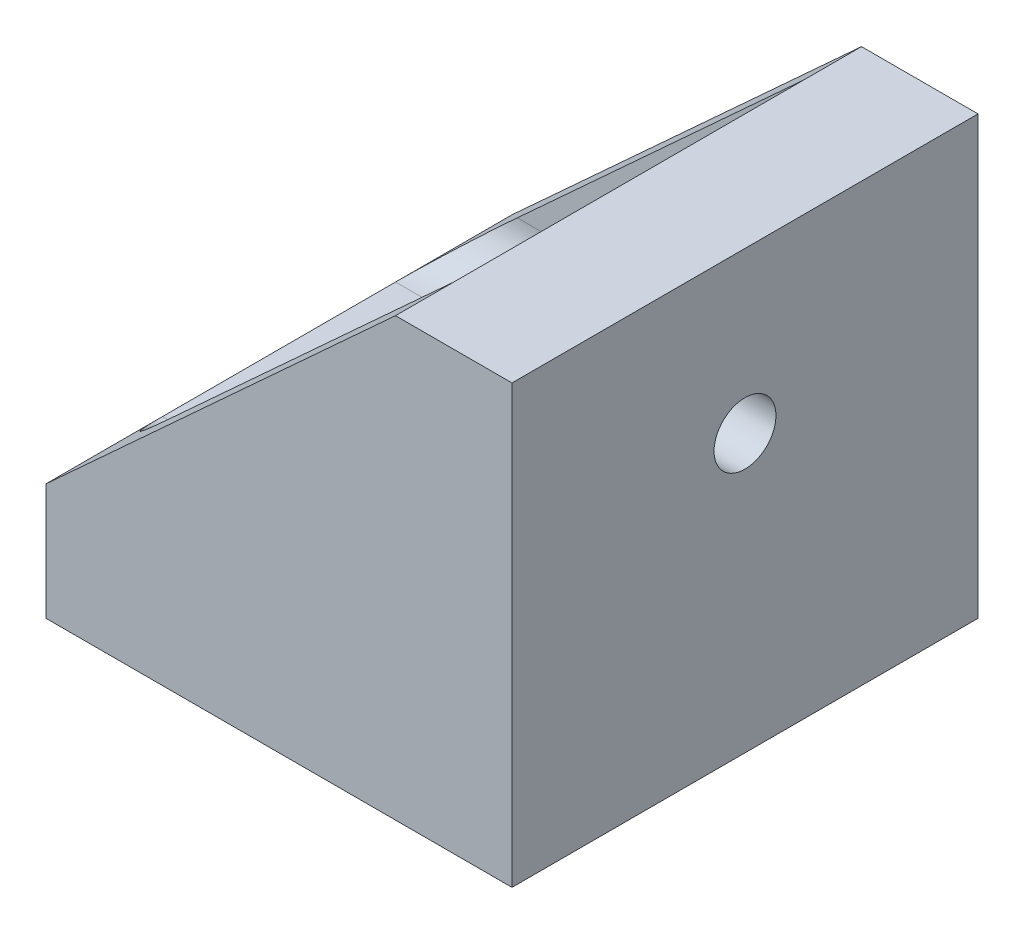
ISO-10303-21;
HEADER;
FILE_DESCRIPTION(('STEP AP214'),'2;1');
FILE_NAME('part.step','',(''),(''),'','','');
FILE_SCHEMA(('AUTOMOTIVE_DESIGN { 1 0 10303 214 1 1 1 1 }'));
ENDSEC;
DATA;
#1=APPLICATION_CONTEXT('core data for automotive mechanical design processes');
#2=APPLICATION_PROTOCOL_DEFINITION('international standard','automotive_design',2000,#1);
#3=PRODUCT_CONTEXT('',#1,'mechanical');
#4=PRODUCT('Part','Part','',(#3));
#5=PRODUCT_RELATED_PRODUCT_CATEGORY('part','',(#4));
#6=PRODUCT_DEFINITION_FORMATION('','',#4);
#7=PRODUCT_DEFINITION_CONTEXT('part definition',#1,'design');
#8=PRODUCT_DEFINITION('design','',#6,#7);
#9=PRODUCT_DEFINITION_SHAPE('','',#8);
#10=(LENGTH_UNIT() NAMED_UNIT(*) SI_UNIT(.MILLI.,.METRE.));
#11=(NAMED_UNIT(*) PLANE_ANGLE_UNIT() SI_UNIT($,.RADIAN.));
#12=(NAMED_UNIT(*) SI_UNIT($,.STERADIAN.) SOLID_ANGLE_UNIT());
#13=UNCERTAINTY_MEASURE_WITH_UNIT(LENGTH_MEASURE(1.E-05),#10,'distance_accuracy_value','');
#14=(GEOMETRIC_REPRESENTATION_CONTEXT(3) GLOBAL_UNCERTAINTY_ASSIGNED_CONTEXT((#13)) GLOBAL_UNIT_ASSIGNED_CONTEXT((#10,
#11,#12)) REPRESENTATION_CONTEXT('',''));
#15=CARTESIAN_POINT('',(0.,0.,0.));
#16=DIRECTION('',(0.,0.,1.));
#17=DIRECTION('',(1.,0.,0.));
#18=AXIS2_PLACEMENT_3D('',#15,#16,#17);
#19=CARTESIAN_POINT('',(76.2,25.4,50.8));
#20=DIRECTION('',(1.,0.,0.));
#21=DIRECTION('',(0.,0.,-1.));
#22=AXIS2_PLACEMENT_3D('',#19,#20,#21);
#23=PLANE('',#22);
#24=CARTESIAN_POINT('',(76.2,60.325,0.));
#25=DIRECTION('',(-1.,0.,0.));
#26=DIRECTION('',(0.,0.,1.));
#27=AXIS2_PLACEMENT_3D('',#24,#25,#26);
#28=CIRCLE('',#27,11.89);
#29=CARTESIAN_POINT('',(76.2,60.325,11.89));
#30=VERTEX_POINT('',#29);
#31=EDGE_CURVE('E150',#30,#30,#28,.T.);
#32=ORIENTED_EDGE('',*,*,#31,.F.);
#33=EDGE_LOOP('',(#32));
#34=FACE_BOUND('',#33,.T.);
#35=DIRECTION('',(0.,-1.,0.));
#36=VECTOR('',#35,1.);
#37=CARTESIAN_POINT('',(76.2,25.4,-38.1));
#38=LINE('',#37,#36);
#39=CARTESIAN_POINT('',(76.2,95.25,-38.1));
#40=VERTEX_POINT('',#39);
#41=CARTESIAN_POINT('',(76.2,38.1,-38.1));
#42=VERTEX_POINT('',#41);
#43=EDGE_CURVE('E114',#40,#42,#38,.T.);
#44=ORIENTED_EDGE('',*,*,#43,.T.);
#45=DIRECTION('',(0.,0.,-1.));
#46=VECTOR('',#45,1.);
#47=CARTESIAN_POINT('',(76.2,38.1,38.1));
#48=LINE('',#47,#46);
#49=CARTESIAN_POINT('',(76.2,38.1,38.1));
#50=VERTEX_POINT('',#49);
#51=EDGE_CURVE('E107',#42,#50,#48,.F.);
#52=ORIENTED_EDGE('',*,*,#51,.T.);
#53=DIRECTION('',(0.,-1.,0.));
#54=VECTOR('',#53,1.);
#55=CARTESIAN_POINT('',(76.2,25.4,38.1));
#56=LINE('',#55,#54);
#57=CARTESIAN_POINT('',(76.2,95.25,38.1));
#58=VERTEX_POINT('',#57);
#59=EDGE_CURVE('E134',#58,#50,#56,.T.);
#60=ORIENTED_EDGE('',*,*,#59,.F.);
#61=DIRECTION('',(0.,0.,-1.));
#62=VECTOR('',#61,1.);
#63=CARTESIAN_POINT('',(76.2,95.25,50.8));
#64=LINE('',#63,#62);
#65=EDGE_CURVE('E188',#58,#40,#64,.T.);
#66=ORIENTED_EDGE('',*,*,#65,.T.);
#67=EDGE_LOOP('',(#44,#52,#60,#66));
#68=FACE_BOUND('',#67,.T.);
#69=ADVANCED_FACE('F39',(#34,#68),#23,.F.);
#70=CARTESIAN_POINT('',(0.,25.4,50.8));
#71=DIRECTION('',(0.,-1.,0.));
#72=DIRECTION('',(0.,0.,-1.));
#73=AXIS2_PLACEMENT_3D('',#70,#71,#72);
#74=PLANE('',#73);
#75=DIRECTION('',(0.,0.,-1.));
#76=VECTOR('',#75,1.);
#77=CARTESIAN_POINT('',(63.5,25.4,-38.1));
#78=LINE('',#77,#76);
#79=CARTESIAN_POINT('',(63.5,25.4,25.4));
#80=VERTEX_POINT('',#79);
#81=CARTESIAN_POINT('',(63.5,25.4,-25.4));
#82=VERTEX_POINT('',#81);
#83=EDGE_CURVE('E200',#80,#82,#78,.T.);
#84=ORIENTED_EDGE('',*,*,#83,.T.);
#85=DIRECTION('',(-1.,0.,0.));
#86=VECTOR('',#85,1.);
#87=CARTESIAN_POINT('',(0.,25.4,-25.4));
#88=LINE('',#87,#86);
#89=CARTESIAN_POINT('',(0.,25.4,-25.4));
#90=VERTEX_POINT('',#89);
#91=EDGE_CURVE('E120',#82,#90,#88,.T.);
#92=ORIENTED_EDGE('',*,*,#91,.T.);
#93=DIRECTION('',(0.,0.,-1.));
#94=VECTOR('',#93,1.);
#95=CARTESIAN_POINT('',(0.,25.4,50.8));
#96=LINE('',#95,#94);
#97=CARTESIAN_POINT('',(0.,25.4,25.4));
#98=VERTEX_POINT('',#97);
#99=EDGE_CURVE('E176',#98,#90,#96,.T.);
#100=ORIENTED_EDGE('',*,*,#99,.F.);
#101=DIRECTION('',(-1.,0.,0.));
#102=VECTOR('',#101,1.);
#103=CARTESIAN_POINT('',(76.2,25.4,25.4));
#104=LINE('',#103,#102);
#105=EDGE_CURVE('E123',#98,#80,#104,.F.);
#106=ORIENTED_EDGE('',*,*,#105,.T.);
#107=EDGE_LOOP('',(#84,#92,#100,#106));
#108=FACE_BOUND('',#107,.T.);
#109=ADVANCED_FACE('F203',(#108),#74,.F.);
#110=CARTESIAN_POINT('',(0.,0.,50.8));
#111=DIRECTION('',(1.,0.,0.));
#112=DIRECTION('',(0.,0.,-1.));
#113=AXIS2_PLACEMENT_3D('',#110,#111,#112);
#114=PLANE('',#113);
#115=DIRECTION('',(0.,-1.,0.));
#116=VECTOR('',#115,1.);
#117=CARTESIAN_POINT('',(0.,0.,-50.8));
#118=LINE('',#117,#116);
#119=CARTESIAN_POINT('',(0.,25.4,-50.8));
#120=VERTEX_POINT('',#119);
#121=CARTESIAN_POINT('',(0.,0.,-50.8));
#122=VERTEX_POINT('',#121);
#123=EDGE_CURVE('E163',#120,#122,#118,.T.);
#124=ORIENTED_EDGE('',*,*,#123,.T.);
#125=DIRECTION('',(0.,0.,-1.));
#126=VECTOR('',#125,1.);
#127=CARTESIAN_POINT('',(0.,0.,50.8));
#128=LINE('',#127,#126);
#129=CARTESIAN_POINT('',(0.,0.,50.8));
#130=VERTEX_POINT('',#129);
#131=EDGE_CURVE('E197',#130,#122,#128,.T.);
#132=ORIENTED_EDGE('',*,*,#131,.F.);
#133=DIRECTION('',(0.,-1.,0.));
#134=VECTOR('',#133,1.);
#135=CARTESIAN_POINT('',(0.,0.,50.8));
#136=LINE('',#135,#134);
#137=CARTESIAN_POINT('',(0.,25.4,50.8));
#138=VERTEX_POINT('',#137);
#139=EDGE_CURVE('E164',#138,#130,#136,.T.);
#140=ORIENTED_EDGE('',*,*,#139,.F.);
#141=EDGE_CURVE('E56',#138,#98,#96,.T.);
#142=ORIENTED_EDGE('',*,*,#141,.T.);
#143=ORIENTED_EDGE('',*,*,#99,.T.);
#144=DIRECTION('',(0.,0.,-1.));
#145=VECTOR('',#144,1.);
#146=CARTESIAN_POINT('',(0.,25.4,-38.1));
#147=LINE('',#146,#145);
#148=EDGE_CURVE('E79',#90,#120,#147,.T.);
#149=ORIENTED_EDGE('',*,*,#148,.T.);
#150=EDGE_LOOP('',(#124,#132,#140,#142,#143,#149));
#151=FACE_BOUND('',#150,.T.);
#152=ADVANCED_FACE('F207',(#151),#114,.F.);
#153=CARTESIAN_POINT('',(0.,0.,50.8));
#154=DIRECTION('',(0.,1.,0.));
#155=DIRECTION('',(0.,0.,1.));
#156=AXIS2_PLACEMENT_3D('',#153,#154,#155);
#157=PLANE('',#156);
#158=DIRECTION('',(1.,0.,0.));
#159=VECTOR('',#158,1.);
#160=CARTESIAN_POINT('',(0.,0.,-50.8));
#161=LINE('',#160,#159);
#162=CARTESIAN_POINT('',(101.6,0.,-50.8));
#163=VERTEX_POINT('',#162);
#164=EDGE_CURVE('E179',#122,#163,#161,.T.);
#165=ORIENTED_EDGE('',*,*,#164,.T.);
#166=DIRECTION('',(0.,0.,-1.));
#167=VECTOR('',#166,1.);
#168=CARTESIAN_POINT('',(101.6,0.,50.8));
#169=LINE('',#168,#167);
#170=CARTESIAN_POINT('',(101.6,0.,50.8));
#171=VERTEX_POINT('',#170);
#172=EDGE_CURVE('E194',#171,#163,#169,.T.);
#173=ORIENTED_EDGE('',*,*,#172,.F.);
#174=DIRECTION('',(1.,0.,0.));
#175=VECTOR('',#174,1.);
#176=CARTESIAN_POINT('',(0.,0.,50.8));
#177=LINE('',#176,#175);
#178=EDGE_CURVE('E167',#130,#171,#177,.T.);
#179=ORIENTED_EDGE('',*,*,#178,.F.);
#180=ORIENTED_EDGE('',*,*,#131,.T.);
#181=EDGE_LOOP('',(#165,#173,#179,#180));
#182=FACE_BOUND('',#181,.T.);
#183=ADVANCED_FACE('F254',(#182),#157,.F.);
#184=CARTESIAN_POINT('',(101.6,25.4,50.8));
#185=DIRECTION('',(-1.,0.,0.));
#186=DIRECTION('',(0.,0.,1.));
#187=AXIS2_PLACEMENT_3D('',#184,#185,#186);
#188=PLANE('',#187);
#189=CARTESIAN_POINT('',(101.6,60.325,0.));
#190=DIRECTION('',(-1.,0.,0.));
#191=DIRECTION('',(0.,0.,1.));
#192=AXIS2_PLACEMENT_3D('',#189,#190,#191);
#193=CIRCLE('',#192,6.75);
#194=CARTESIAN_POINT('',(101.6,60.325,6.75));
#195=VERTEX_POINT('',#194);
#196=EDGE_CURVE('E160',#195,#195,#193,.T.);
#197=ORIENTED_EDGE('',*,*,#196,.T.);
#198=EDGE_LOOP('',(#197));
#199=FACE_BOUND('',#198,.T.);
#200=DIRECTION('',(0.,1.,0.));
#201=VECTOR('',#200,1.);
#202=CARTESIAN_POINT('',(101.6,25.4,-50.8));
#203=LINE('',#202,#201);
#204=CARTESIAN_POINT('',(101.6,95.25,-50.8));
#205=VERTEX_POINT('',#204);
#206=EDGE_CURVE('E182',#163,#205,#203,.T.);
#207=ORIENTED_EDGE('',*,*,#206,.T.);
#208=DIRECTION('',(0.,0.,-1.));
#209=VECTOR('',#208,1.);
#210=CARTESIAN_POINT('',(101.6,95.25,50.8));
#211=LINE('',#210,#209);
#212=CARTESIAN_POINT('',(101.6,95.25,50.8));
#213=VERTEX_POINT('',#212);
#214=EDGE_CURVE('E191',#213,#205,#211,.T.);
#215=ORIENTED_EDGE('',*,*,#214,.F.);
#216=DIRECTION('',(0.,1.,0.));
#217=VECTOR('',#216,1.);
#218=CARTESIAN_POINT('',(101.6,0.,50.8));
#219=LINE('',#218,#217);
#220=EDGE_CURVE('E171',#171,#213,#219,.T.);
#221=ORIENTED_EDGE('',*,*,#220,.F.);
#222=ORIENTED_EDGE('',*,*,#172,.T.);
#223=EDGE_LOOP('',(#207,#215,#221,#222));
#224=FACE_BOUND('',#223,.T.);
#225=ADVANCED_FACE('F245',(#199,#224),#188,.F.);
#226=CARTESIAN_POINT('',(101.6,95.25,50.8));
#227=DIRECTION('',(0.,-1.,0.));
#228=DIRECTION('',(1.,0.,0.));
#229=AXIS2_PLACEMENT_3D('',#226,#227,#228);
#230=PLANE('',#229);
#231=DIRECTION('',(-1.,0.,0.));
#232=VECTOR('',#231,1.);
#233=CARTESIAN_POINT('',(101.6,95.25,-50.8));
#234=LINE('',#233,#232);
#235=CARTESIAN_POINT('',(76.2,95.25,-50.8));
#236=VERTEX_POINT('',#235);
#237=EDGE_CURVE('E168',#205,#236,#234,.T.);
#238=ORIENTED_EDGE('',*,*,#237,.T.);
#239=DIRECTION('',(0.,0.,-1.));
#240=VECTOR('',#239,1.);
#241=CARTESIAN_POINT('',(76.2,95.25,-38.1));
#242=LINE('',#241,#240);
#243=EDGE_CURVE('E148',#40,#236,#242,.T.);
#244=ORIENTED_EDGE('',*,*,#243,.F.);
#245=ORIENTED_EDGE('',*,*,#65,.F.);
#246=CARTESIAN_POINT('',(76.2,95.25,50.8));
#247=VERTEX_POINT('',#246);
#248=EDGE_CURVE('E189',#247,#58,#64,.T.);
#249=ORIENTED_EDGE('',*,*,#248,.F.);
#250=DIRECTION('',(-1.,0.,0.));
#251=VECTOR('',#250,1.);
#252=CARTESIAN_POINT('',(101.6,95.25,50.8));
#253=LINE('',#252,#251);
#254=EDGE_CURVE('E174',#213,#247,#253,.T.);
#255=ORIENTED_EDGE('',*,*,#254,.F.);
#256=ORIENTED_EDGE('',*,*,#214,.T.);
#257=EDGE_LOOP('',(#238,#244,#245,#249,#255,#256));
#258=FACE_BOUND('',#257,.T.);
#259=ADVANCED_FACE('F242',(#258),#230,.F.);
#260=CARTESIAN_POINT('',(0.,0.,50.8));
#261=DIRECTION('',(0.,0.,-1.));
#262=DIRECTION('',(-1.,0.,0.));
#263=AXIS2_PLACEMENT_3D('',#260,#261,#262);
#264=PLANE('',#263);
#265=ORIENTED_EDGE('',*,*,#139,.T.);
#266=ORIENTED_EDGE('',*,*,#178,.T.);
#267=ORIENTED_EDGE('',*,*,#220,.T.);
#268=ORIENTED_EDGE('',*,*,#254,.T.);
#269=DIRECTION('',(0.737154140200741,0.675724628517346,0.));
#270=VECTOR('',#269,1.);
#271=CARTESIAN_POINT('',(76.2,95.25,50.8));
#272=LINE('',#271,#270);
#273=EDGE_CURVE('E128',#138,#247,#272,.T.);
#274=ORIENTED_EDGE('',*,*,#273,.F.);
#275=EDGE_LOOP('',(#265,#266,#267,#268,#274));
#276=FACE_BOUND('',#275,.T.);
#277=ADVANCED_FACE('F244',(#276),#264,.F.);
#278=CARTESIAN_POINT('',(0.,0.,-50.8));
#279=DIRECTION('',(0.,0.,-1.));
#280=DIRECTION('',(-1.,0.,0.));
#281=AXIS2_PLACEMENT_3D('',#278,#279,#280);
#282=PLANE('',#281);
#283=ORIENTED_EDGE('',*,*,#123,.F.);
#284=DIRECTION('',(0.737154140200741,0.675724628517346,0.));
#285=VECTOR('',#284,1.);
#286=CARTESIAN_POINT('',(76.2,95.25,-50.8));
#287=LINE('',#286,#285);
#288=EDGE_CURVE('E144',#120,#236,#287,.T.);
#289=ORIENTED_EDGE('',*,*,#288,.T.);
#290=ORIENTED_EDGE('',*,*,#237,.F.);
#291=ORIENTED_EDGE('',*,*,#206,.F.);
#292=ORIENTED_EDGE('',*,*,#164,.F.);
#293=EDGE_LOOP('',(#283,#289,#290,#291,#292));
#294=FACE_BOUND('',#293,.T.);
#295=ADVANCED_FACE('F217',(#294),#282,.T.);
#296=CARTESIAN_POINT('',(76.2,60.325,0.));
#297=DIRECTION('',(-1.,0.,0.));
#298=DIRECTION('',(0.,0.,1.));
#299=AXIS2_PLACEMENT_3D('',#296,#297,#298);
#300=CYLINDRICAL_SURFACE('',#299,6.75);
#301=ORIENTED_EDGE('',*,*,#196,.F.);
#302=EDGE_LOOP('',(#301));
#303=FACE_BOUND('',#302,.T.);
#304=CARTESIAN_POINT('',(84.15,60.325,0.));
#305=DIRECTION('',(-1.,0.,0.));
#306=DIRECTION('',(0.,0.,1.));
#307=AXIS2_PLACEMENT_3D('',#304,#305,#306);
#308=CIRCLE('',#307,6.75);
#309=CARTESIAN_POINT('',(84.15,60.325,6.75));
#310=VERTEX_POINT('',#309);
#311=EDGE_CURVE('E157',#310,#310,#308,.T.);
#312=ORIENTED_EDGE('',*,*,#311,.T.);
#313=EDGE_LOOP('',(#312));
#314=FACE_BOUND('',#313,.T.);
#315=ADVANCED_FACE('F266',(#303,#314),#300,.F.);
#316=CARTESIAN_POINT('',(84.15,67.075,0.));
#317=DIRECTION('',(1.,0.,0.));
#318=DIRECTION('',(0.,0.,-1.));
#319=AXIS2_PLACEMENT_3D('',#316,#317,#318);
#320=PLANE('',#319);
#321=ORIENTED_EDGE('',*,*,#311,.F.);
#322=EDGE_LOOP('',(#321));
#323=FACE_BOUND('',#322,.T.);
#324=CARTESIAN_POINT('',(84.15,60.325,0.));
#325=DIRECTION('',(-1.,0.,0.));
#326=DIRECTION('',(0.,0.,1.));
#327=AXIS2_PLACEMENT_3D('',#324,#325,#326);
#328=CIRCLE('',#327,11.89);
#329=CARTESIAN_POINT('',(84.15,60.325,11.89));
#330=VERTEX_POINT('',#329);
#331=EDGE_CURVE('E154',#330,#330,#328,.T.);
#332=ORIENTED_EDGE('',*,*,#331,.T.);
#333=EDGE_LOOP('',(#332));
#334=FACE_BOUND('',#333,.T.);
#335=ADVANCED_FACE('F270',(#323,#334),#320,.F.);
#336=CARTESIAN_POINT('',(76.2,60.325,0.));
#337=DIRECTION('',(-1.,0.,0.));
#338=DIRECTION('',(0.,0.,1.));
#339=AXIS2_PLACEMENT_3D('',#336,#337,#338);
#340=CYLINDRICAL_SURFACE('',#339,11.89);
#341=ORIENTED_EDGE('',*,*,#331,.F.);
#342=EDGE_LOOP('',(#341));
#343=FACE_BOUND('',#342,.T.);
#344=ORIENTED_EDGE('',*,*,#31,.T.);
#345=EDGE_LOOP('',(#344));
#346=FACE_BOUND('',#345,.T.);
#347=ADVANCED_FACE('F274',(#343,#346),#340,.F.);
#348=CARTESIAN_POINT('',(76.2,95.25,-38.1));
#349=DIRECTION('',(-0.675724628517346,0.737154140200741,0.));
#350=DIRECTION('',(-0.737154140200741,-0.675724628517346,0.));
#351=AXIS2_PLACEMENT_3D('',#348,#349,#350);
#352=PLANE('',#351);
#353=ORIENTED_EDGE('',*,*,#288,.F.);
#354=ORIENTED_EDGE('',*,*,#148,.F.);
#355=CARTESIAN_POINT('',(13.8545454545454,38.1,-25.4));
#356=DIRECTION('',(-0.675724628517346,0.737154140200741,0.));
#357=DIRECTION('',(0.737154140200741,0.675724628517346,0.));
#358=AXIS2_PLACEMENT_3D('',#355,#356,#357);
#359=ELLIPSE('',#358,18.7946383245878,12.7);
#360=CARTESIAN_POINT('',(13.8545454545455,38.1,-38.1));
#361=VERTEX_POINT('',#360);
#362=EDGE_CURVE('E48',#90,#361,#359,.F.);
#363=ORIENTED_EDGE('',*,*,#362,.T.);
#364=DIRECTION('',(0.737154140200741,0.675724628517346,0.));
#365=VECTOR('',#364,1.);
#366=CARTESIAN_POINT('',(76.2,95.25,-38.1));
#367=LINE('',#366,#365);
#368=EDGE_CURVE('E89',#361,#40,#367,.T.);
#369=ORIENTED_EDGE('',*,*,#368,.T.);
#370=ORIENTED_EDGE('',*,*,#243,.T.);
#371=EDGE_LOOP('',(#353,#354,#363,#369,#370));
#372=FACE_BOUND('',#371,.T.);
#373=ADVANCED_FACE('F102',(#372),#352,.T.);
#374=CARTESIAN_POINT('',(0.,0.,-38.1));
#375=DIRECTION('',(0.,0.,-1.));
#376=DIRECTION('',(-1.,0.,0.));
#377=AXIS2_PLACEMENT_3D('',#374,#375,#376);
#378=PLANE('',#377);
#379=ORIENTED_EDGE('',*,*,#368,.F.);
#380=DIRECTION('',(-1.,0.,0.));
#381=VECTOR('',#380,1.);
#382=CARTESIAN_POINT('',(76.2,38.1,-38.1));
#383=LINE('',#382,#381);
#384=EDGE_CURVE('E112',#361,#42,#383,.F.);
#385=ORIENTED_EDGE('',*,*,#384,.T.);
#386=ORIENTED_EDGE('',*,*,#43,.F.);
#387=EDGE_LOOP('',(#379,#385,#386));
#388=FACE_BOUND('',#387,.T.);
#389=ADVANCED_FACE('F111',(#388),#378,.F.);
#390=CARTESIAN_POINT('',(76.2,95.25,38.1));
#391=DIRECTION('',(0.675724628517346,-0.737154140200741,0.));
#392=DIRECTION('',(0.737154140200741,0.675724628517346,0.));
#393=AXIS2_PLACEMENT_3D('',#390,#391,#392);
#394=PLANE('',#393);
#395=ORIENTED_EDGE('',*,*,#273,.T.);
#396=ORIENTED_EDGE('',*,*,#248,.T.);
#397=DIRECTION('',(0.737154140200741,0.675724628517346,0.));
#398=VECTOR('',#397,1.);
#399=CARTESIAN_POINT('',(76.2,95.25,38.1));
#400=LINE('',#399,#398);
#401=CARTESIAN_POINT('',(13.8545454545455,38.1,38.1));
#402=VERTEX_POINT('',#401);
#403=EDGE_CURVE('E140',#402,#58,#400,.T.);
#404=ORIENTED_EDGE('',*,*,#403,.F.);
#405=CARTESIAN_POINT('',(13.8545454545454,38.1,25.4));
#406=DIRECTION('',(0.675724628517346,-0.737154140200741,0.));
#407=DIRECTION('',(0.737154140200741,0.675724628517346,0.));
#408=AXIS2_PLACEMENT_3D('',#405,#406,#407);
#409=ELLIPSE('',#408,18.7946383245878,12.7);
#410=EDGE_CURVE('E11',#402,#98,#409,.T.);
#411=ORIENTED_EDGE('',*,*,#410,.T.);
#412=ORIENTED_EDGE('',*,*,#141,.F.);
#413=EDGE_LOOP('',(#395,#396,#404,#411,#412));
#414=FACE_BOUND('',#413,.T.);
#415=ADVANCED_FACE('F238',(#414),#394,.F.);
#416=CARTESIAN_POINT('',(0.,0.,38.1));
#417=DIRECTION('',(0.,0.,1.));
#418=DIRECTION('',(-1.,0.,0.));
#419=AXIS2_PLACEMENT_3D('',#416,#417,#418);
#420=PLANE('',#419);
#421=ORIENTED_EDGE('',*,*,#59,.T.);
#422=DIRECTION('',(-1.,0.,0.));
#423=VECTOR('',#422,1.);
#424=CARTESIAN_POINT('',(0.,38.1,38.1));
#425=LINE('',#424,#423);
#426=EDGE_CURVE('E65',#50,#402,#425,.T.);
#427=ORIENTED_EDGE('',*,*,#426,.T.);
#428=ORIENTED_EDGE('',*,*,#403,.T.);
#429=EDGE_LOOP('',(#421,#427,#428));
#430=FACE_BOUND('',#429,.T.);
#431=ADVANCED_FACE('F235',(#430),#420,.F.);
#432=CARTESIAN_POINT('',(0.,38.1,25.4));
#433=DIRECTION('',(1.,0.,0.));
#434=DIRECTION('',(0.,0.,-1.));
#435=AXIS2_PLACEMENT_3D('',#432,#433,#434);
#436=CYLINDRICAL_SURFACE('',#435,12.7);
#437=ORIENTED_EDGE('',*,*,#410,.F.);
#438=ORIENTED_EDGE('',*,*,#426,.F.);
#439=CARTESIAN_POINT('',(63.5,38.1,25.4));
#440=DIRECTION('',(0.707106781186547,0.,-0.707106781186547));
#441=DIRECTION('',(0.707106781186547,0.,0.707106781186547));
#442=AXIS2_PLACEMENT_3D('',#439,#440,#441);
#443=ELLIPSE('',#442,17.9605122421383,12.7);
#444=EDGE_CURVE('E43',#80,#50,#443,.F.);
#445=ORIENTED_EDGE('',*,*,#444,.F.);
#446=ORIENTED_EDGE('',*,*,#105,.F.);
#447=EDGE_LOOP('',(#437,#438,#445,#446));
#448=FACE_BOUND('',#447,.T.);
#449=ADVANCED_FACE('F41',(#448),#436,.F.);
#450=CARTESIAN_POINT('',(63.5,38.1,50.8));
#451=DIRECTION('',(0.,0.,1.));
#452=DIRECTION('',(1.,0.,0.));
#453=AXIS2_PLACEMENT_3D('',#450,#451,#452);
#454=CYLINDRICAL_SURFACE('',#453,12.7);
#455=ORIENTED_EDGE('',*,*,#444,.T.);
#456=ORIENTED_EDGE('',*,*,#51,.F.);
#457=CARTESIAN_POINT('',(63.5,38.1,-25.4));
#458=DIRECTION('',(0.707106781186547,0.,0.707106781186547));
#459=DIRECTION('',(0.707106781186547,0.,-0.707106781186547));
#460=AXIS2_PLACEMENT_3D('',#457,#458,#459);
#461=ELLIPSE('',#460,17.9605122421383,12.7);
#462=EDGE_CURVE('E119',#82,#42,#461,.T.);
#463=ORIENTED_EDGE('',*,*,#462,.F.);
#464=ORIENTED_EDGE('',*,*,#83,.F.);
#465=EDGE_LOOP('',(#455,#456,#463,#464));
#466=FACE_BOUND('',#465,.T.);
#467=ADVANCED_FACE('F206',(#466),#454,.F.);
#468=CARTESIAN_POINT('',(0.,38.1,-25.4));
#469=DIRECTION('',(1.,0.,0.));
#470=DIRECTION('',(0.,0.,-1.));
#471=AXIS2_PLACEMENT_3D('',#468,#469,#470);
#472=CYLINDRICAL_SURFACE('',#471,12.7);
#473=ORIENTED_EDGE('',*,*,#462,.T.);
#474=ORIENTED_EDGE('',*,*,#384,.F.);
#475=ORIENTED_EDGE('',*,*,#362,.F.);
#476=ORIENTED_EDGE('',*,*,#91,.F.);
#477=EDGE_LOOP('',(#473,#474,#475,#476));
#478=FACE_BOUND('',#477,.T.);
#479=ADVANCED_FACE('F117',(#478),#472,.F.);
#480=CLOSED_SHELL('',(#69,#109,#152,#183,#225,#259,#277,#295,#315,#335,#347,#373,#389,#415,#431,
#449,#467,#479));
#481=MANIFOLD_SOLID_BREP('B2',#480);
#482=ADVANCED_BREP_SHAPE_REPRESENTATION('',(#18,#481),#14);
#483=SHAPE_DEFINITION_REPRESENTATION(#9,#482);
ENDSEC;
END-ISO-10303-21;
